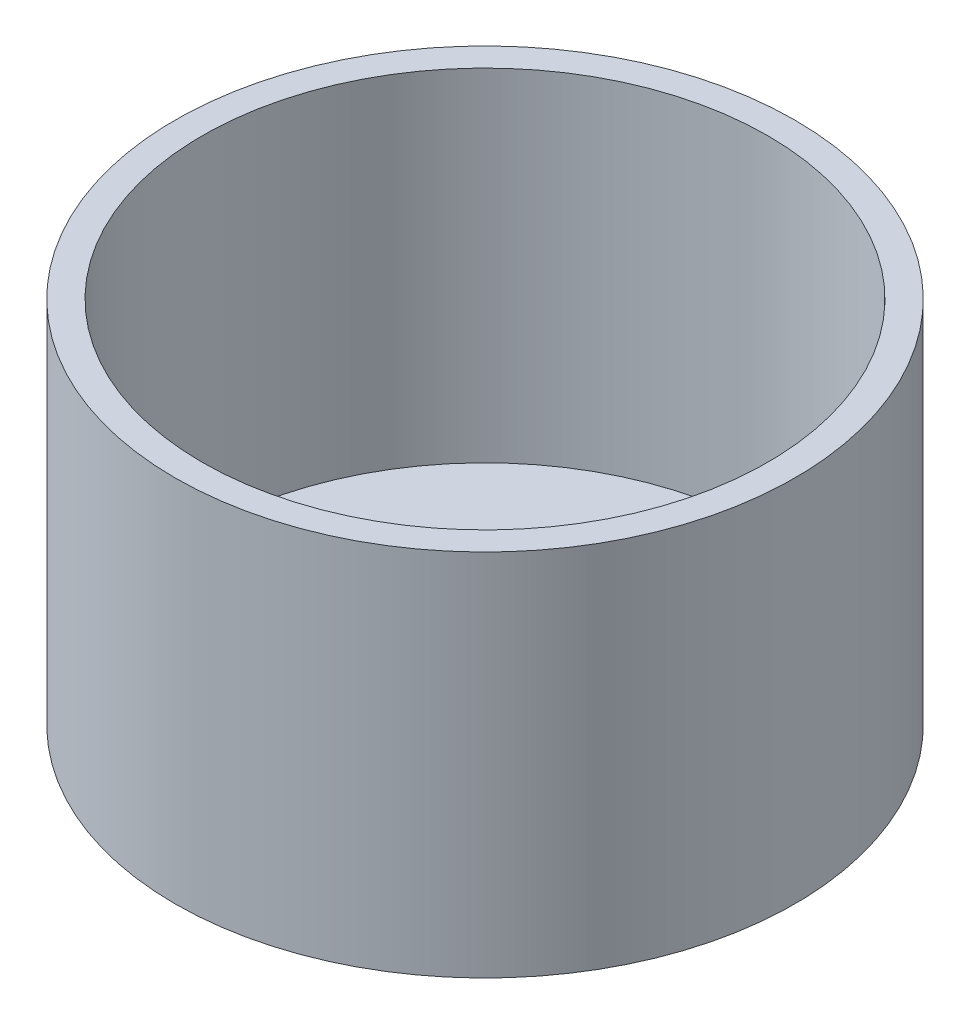
ISO-10303-21;
HEADER;
FILE_DESCRIPTION(('STEP AP214'),'2;1');
FILE_NAME('part.step','',(''),(''),'','','');
FILE_SCHEMA(('AUTOMOTIVE_DESIGN { 1 0 10303 214 1 1 1 1 }'));
ENDSEC;
DATA;
#1=APPLICATION_CONTEXT('core data for automotive mechanical design processes');
#2=APPLICATION_PROTOCOL_DEFINITION('international standard','automotive_design',2000,#1);
#3=PRODUCT_CONTEXT('',#1,'mechanical');
#4=PRODUCT('Part','Part','',(#3));
#5=PRODUCT_RELATED_PRODUCT_CATEGORY('part','',(#4));
#6=PRODUCT_DEFINITION_FORMATION('','',#4);
#7=PRODUCT_DEFINITION_CONTEXT('part definition',#1,'design');
#8=PRODUCT_DEFINITION('design','',#6,#7);
#9=PRODUCT_DEFINITION_SHAPE('','',#8);
#10=(LENGTH_UNIT() NAMED_UNIT(*) SI_UNIT(.MILLI.,.METRE.));
#11=(NAMED_UNIT(*) PLANE_ANGLE_UNIT() SI_UNIT($,.RADIAN.));
#12=(NAMED_UNIT(*) SI_UNIT($,.STERADIAN.) SOLID_ANGLE_UNIT());
#13=UNCERTAINTY_MEASURE_WITH_UNIT(LENGTH_MEASURE(1.E-05),#10,'distance_accuracy_value','');
#14=(GEOMETRIC_REPRESENTATION_CONTEXT(3) GLOBAL_UNCERTAINTY_ASSIGNED_CONTEXT((#13)) GLOBAL_UNIT_ASSIGNED_CONTEXT((#10,
#11,#12)) REPRESENTATION_CONTEXT('',''));
#15=CARTESIAN_POINT('',(0.,0.,0.));
#16=DIRECTION('',(0.,0.,1.));
#17=DIRECTION('',(1.,0.,0.));
#18=AXIS2_PLACEMENT_3D('',#15,#16,#17);
#19=CARTESIAN_POINT('',(0.,0.,0.));
#20=DIRECTION('',(0.,1.,0.));
#21=DIRECTION('',(0.,0.,1.));
#22=AXIS2_PLACEMENT_3D('',#19,#20,#21);
#23=PLANE('',#22);
#24=CARTESIAN_POINT('',(0.,0.,-8.5));
#25=DIRECTION('',(0.,-1.,0.));
#26=DIRECTION('',(-1.,0.,0.));
#27=AXIS2_PLACEMENT_3D('',#24,#25,#26);
#28=CIRCLE('',#27,1.55);
#29=CARTESIAN_POINT('',(-1.55000000000003,0.,-8.49999999999999));
#30=VERTEX_POINT('',#29);
#31=EDGE_CURVE('E72',#30,#30,#28,.T.);
#32=ORIENTED_EDGE('',*,*,#31,.F.);
#33=EDGE_LOOP('',(#32));
#34=FACE_BOUND('',#33,.T.);
#35=CARTESIAN_POINT('',(-8.5,0.,0.));
#36=DIRECTION('',(0.,-1.,0.));
#37=DIRECTION('',(0.,0.,1.));
#38=AXIS2_PLACEMENT_3D('',#35,#36,#37);
#39=CIRCLE('',#38,1.55);
#40=CARTESIAN_POINT('',(-8.5,0.,1.55));
#41=VERTEX_POINT('',#40);
#42=EDGE_CURVE('E62',#41,#41,#39,.T.);
#43=ORIENTED_EDGE('',*,*,#42,.F.);
#44=EDGE_LOOP('',(#43));
#45=FACE_BOUND('',#44,.T.);
#46=CARTESIAN_POINT('',(0.,0.,8.5));
#47=DIRECTION('',(0.,-1.,0.));
#48=DIRECTION('',(1.,0.,0.));
#49=AXIS2_PLACEMENT_3D('',#46,#47,#48);
#50=CIRCLE('',#49,1.55);
#51=CARTESIAN_POINT('',(1.55000000000009,0.,8.49999999999999));
#52=VERTEX_POINT('',#51);
#53=EDGE_CURVE('E59',#52,#52,#50,.T.);
#54=ORIENTED_EDGE('',*,*,#53,.F.);
#55=EDGE_LOOP('',(#54));
#56=FACE_BOUND('',#55,.T.);
#57=CARTESIAN_POINT('',(8.5,0.,0.));
#58=DIRECTION('',(0.,-1.,0.));
#59=DIRECTION('',(0.,0.,-1.));
#60=AXIS2_PLACEMENT_3D('',#57,#58,#59);
#61=CIRCLE('',#60,1.55);
#62=CARTESIAN_POINT('',(8.5,0.,-1.55));
#63=VERTEX_POINT('',#62);
#64=EDGE_CURVE('E56',#63,#63,#61,.T.);
#65=ORIENTED_EDGE('',*,*,#64,.F.);
#66=EDGE_LOOP('',(#65));
#67=FACE_BOUND('',#66,.T.);
#68=CARTESIAN_POINT('',(0.,0.,0.));
#69=DIRECTION('',(0.,-1.,0.));
#70=DIRECTION('',(0.,0.,-1.));
#71=AXIS2_PLACEMENT_3D('',#68,#69,#70);
#72=CIRCLE('',#71,2.2);
#73=CARTESIAN_POINT('',(0.,0.,-2.2));
#74=VERTEX_POINT('',#73);
#75=EDGE_CURVE('E52',#74,#74,#72,.T.);
#76=ORIENTED_EDGE('',*,*,#75,.F.);
#77=EDGE_LOOP('',(#76));
#78=FACE_BOUND('',#77,.T.);
#79=CARTESIAN_POINT('',(0.,0.,0.));
#80=DIRECTION('',(0.,1.,0.));
#81=DIRECTION('',(0.,0.,1.));
#82=AXIS2_PLACEMENT_3D('',#79,#80,#81);
#83=CIRCLE('',#82,25.2);
#84=CARTESIAN_POINT('',(0.,0.,25.2));
#85=VERTEX_POINT('',#84);
#86=EDGE_CURVE('E10',#85,#85,#83,.T.);
#87=ORIENTED_EDGE('',*,*,#86,.F.);
#88=EDGE_LOOP('',(#87));
#89=FACE_BOUND('',#88,.T.);
#90=ADVANCED_FACE('F32',(#34,#45,#56,#67,#78,#89),#23,.F.);
#91=CARTESIAN_POINT('',(0.,2.2,0.));
#92=DIRECTION('',(0.,1.,0.));
#93=DIRECTION('',(0.,0.,1.));
#94=AXIS2_PLACEMENT_3D('',#91,#92,#93);
#95=CYLINDRICAL_SURFACE('',#94,25.2);
#96=CARTESIAN_POINT('',(0.,30.,0.));
#97=DIRECTION('',(0.,1.,0.));
#98=DIRECTION('',(0.,0.,1.));
#99=AXIS2_PLACEMENT_3D('',#96,#97,#98);
#100=CIRCLE('',#99,25.2);
#101=CARTESIAN_POINT('',(0.,30.,25.2));
#102=VERTEX_POINT('',#101);
#103=EDGE_CURVE('E39',#102,#102,#100,.T.);
#104=ORIENTED_EDGE('',*,*,#103,.F.);
#105=EDGE_LOOP('',(#104));
#106=FACE_BOUND('',#105,.T.);
#107=ORIENTED_EDGE('',*,*,#86,.T.);
#108=EDGE_LOOP('',(#107));
#109=FACE_BOUND('',#108,.T.);
#110=ADVANCED_FACE('F88',(#106,#109),#95,.T.);
#111=CARTESIAN_POINT('',(23.,30.,0.));
#112=DIRECTION('',(0.,-1.,0.));
#113=DIRECTION('',(0.,0.,-1.));
#114=AXIS2_PLACEMENT_3D('',#111,#112,#113);
#115=PLANE('',#114);
#116=CARTESIAN_POINT('',(0.,30.,0.));
#117=DIRECTION('',(0.,1.,0.));
#118=DIRECTION('',(0.,0.,1.));
#119=AXIS2_PLACEMENT_3D('',#116,#117,#118);
#120=CIRCLE('',#119,23.);
#121=CARTESIAN_POINT('',(0.,30.,23.));
#122=VERTEX_POINT('',#121);
#123=EDGE_CURVE('E44',#122,#122,#120,.T.);
#124=ORIENTED_EDGE('',*,*,#123,.F.);
#125=EDGE_LOOP('',(#124));
#126=FACE_BOUND('',#125,.T.);
#127=ORIENTED_EDGE('',*,*,#103,.T.);
#128=EDGE_LOOP('',(#127));
#129=FACE_BOUND('',#128,.T.);
#130=ADVANCED_FACE('F85',(#126,#129),#115,.F.);
#131=CARTESIAN_POINT('',(0.,2.2,0.));
#132=DIRECTION('',(0.,1.,0.));
#133=DIRECTION('',(0.,0.,1.));
#134=AXIS2_PLACEMENT_3D('',#131,#132,#133);
#135=CYLINDRICAL_SURFACE('',#134,23.);
#136=CARTESIAN_POINT('',(0.,2.2,0.));
#137=DIRECTION('',(0.,1.,0.));
#138=DIRECTION('',(0.,0.,1.));
#139=AXIS2_PLACEMENT_3D('',#136,#137,#138);
#140=CIRCLE('',#139,23.);
#141=CARTESIAN_POINT('',(0.,2.2,23.));
#142=VERTEX_POINT('',#141);
#143=EDGE_CURVE('E51',#142,#142,#140,.T.);
#144=ORIENTED_EDGE('',*,*,#143,.F.);
#145=EDGE_LOOP('',(#144));
#146=FACE_BOUND('',#145,.T.);
#147=ORIENTED_EDGE('',*,*,#123,.T.);
#148=EDGE_LOOP('',(#147));
#149=FACE_BOUND('',#148,.T.);
#150=ADVANCED_FACE('F83',(#146,#149),#135,.F.);
#151=CARTESIAN_POINT('',(0.,2.2,0.));
#152=DIRECTION('',(0.,-1.,0.));
#153=DIRECTION('',(0.,0.,-1.));
#154=AXIS2_PLACEMENT_3D('',#151,#152,#153);
#155=PLANE('',#154);
#156=CARTESIAN_POINT('',(0.,2.2,-8.5));
#157=DIRECTION('',(0.,-1.,0.));
#158=DIRECTION('',(0.,0.,-1.));
#159=AXIS2_PLACEMENT_3D('',#156,#157,#158);
#160=CIRCLE('',#159,1.55);
#161=CARTESIAN_POINT('',(0.,2.2,-10.05));
#162=VERTEX_POINT('',#161);
#163=EDGE_CURVE('E35',#162,#162,#160,.T.);
#164=ORIENTED_EDGE('',*,*,#163,.T.);
#165=EDGE_LOOP('',(#164));
#166=FACE_BOUND('',#165,.T.);
#167=CARTESIAN_POINT('',(-8.5,2.2,0.));
#168=DIRECTION('',(0.,-1.,0.));
#169=DIRECTION('',(0.,0.,-1.));
#170=AXIS2_PLACEMENT_3D('',#167,#168,#169);
#171=CIRCLE('',#170,1.55);
#172=CARTESIAN_POINT('',(-8.5,2.2,-1.55));
#173=VERTEX_POINT('',#172);
#174=EDGE_CURVE('E60',#173,#173,#171,.T.);
#175=ORIENTED_EDGE('',*,*,#174,.T.);
#176=EDGE_LOOP('',(#175));
#177=FACE_BOUND('',#176,.T.);
#178=CARTESIAN_POINT('',(0.,2.2,8.5));
#179=DIRECTION('',(0.,-1.,0.));
#180=DIRECTION('',(0.,0.,-1.));
#181=AXIS2_PLACEMENT_3D('',#178,#179,#180);
#182=CIRCLE('',#181,1.55);
#183=CARTESIAN_POINT('',(0.,2.2,6.95));
#184=VERTEX_POINT('',#183);
#185=EDGE_CURVE('E57',#184,#184,#182,.T.);
#186=ORIENTED_EDGE('',*,*,#185,.T.);
#187=EDGE_LOOP('',(#186));
#188=FACE_BOUND('',#187,.T.);
#189=CARTESIAN_POINT('',(8.5,2.2,0.));
#190=DIRECTION('',(0.,-1.,0.));
#191=DIRECTION('',(0.,0.,-1.));
#192=AXIS2_PLACEMENT_3D('',#189,#190,#191);
#193=CIRCLE('',#192,1.55);
#194=CARTESIAN_POINT('',(8.5,2.2,-1.55));
#195=VERTEX_POINT('',#194);
#196=EDGE_CURVE('E53',#195,#195,#193,.T.);
#197=ORIENTED_EDGE('',*,*,#196,.T.);
#198=EDGE_LOOP('',(#197));
#199=FACE_BOUND('',#198,.T.);
#200=CARTESIAN_POINT('',(0.,2.2,0.));
#201=DIRECTION('',(0.,-1.,0.));
#202=DIRECTION('',(0.,0.,-1.));
#203=AXIS2_PLACEMENT_3D('',#200,#201,#202);
#204=CIRCLE('',#203,2.2);
#205=CARTESIAN_POINT('',(0.,2.2,-2.2));
#206=VERTEX_POINT('',#205);
#207=EDGE_CURVE('E48',#206,#206,#204,.T.);
#208=ORIENTED_EDGE('',*,*,#207,.T.);
#209=EDGE_LOOP('',(#208));
#210=FACE_BOUND('',#209,.T.);
#211=ORIENTED_EDGE('',*,*,#143,.T.);
#212=EDGE_LOOP('',(#211));
#213=FACE_BOUND('',#212,.T.);
#214=ADVANCED_FACE('F100',(#166,#177,#188,#199,#210,#213),#155,.F.);
#215=CARTESIAN_POINT('',(0.,30.,0.));
#216=DIRECTION('',(0.,-1.,0.));
#217=DIRECTION('',(0.,0.,-1.));
#218=AXIS2_PLACEMENT_3D('',#215,#216,#217);
#219=CYLINDRICAL_SURFACE('',#218,2.2);
#220=ORIENTED_EDGE('',*,*,#75,.T.);
#221=EDGE_LOOP('',(#220));
#222=FACE_BOUND('',#221,.T.);
#223=ORIENTED_EDGE('',*,*,#207,.F.);
#224=EDGE_LOOP('',(#223));
#225=FACE_BOUND('',#224,.T.);
#226=ADVANCED_FACE('F104',(#222,#225),#219,.F.);
#227=CARTESIAN_POINT('',(8.5,30.,0.));
#228=DIRECTION('',(0.,-1.,0.));
#229=DIRECTION('',(0.,0.,-1.));
#230=AXIS2_PLACEMENT_3D('',#227,#228,#229);
#231=CYLINDRICAL_SURFACE('',#230,1.55);
#232=ORIENTED_EDGE('',*,*,#64,.T.);
#233=EDGE_LOOP('',(#232));
#234=FACE_BOUND('',#233,.T.);
#235=ORIENTED_EDGE('',*,*,#196,.F.);
#236=EDGE_LOOP('',(#235));
#237=FACE_BOUND('',#236,.T.);
#238=ADVANCED_FACE('F108',(#234,#237),#231,.F.);
#239=CARTESIAN_POINT('',(0.,30.,8.5));
#240=DIRECTION('',(0.,-1.,0.));
#241=DIRECTION('',(0.,0.,-1.));
#242=AXIS2_PLACEMENT_3D('',#239,#240,#241);
#243=CYLINDRICAL_SURFACE('',#242,1.55);
#244=ORIENTED_EDGE('',*,*,#53,.T.);
#245=EDGE_LOOP('',(#244));
#246=FACE_BOUND('',#245,.T.);
#247=ORIENTED_EDGE('',*,*,#185,.F.);
#248=EDGE_LOOP('',(#247));
#249=FACE_BOUND('',#248,.T.);
#250=ADVANCED_FACE('F112',(#246,#249),#243,.F.);
#251=CARTESIAN_POINT('',(-8.5,30.,0.));
#252=DIRECTION('',(0.,-1.,0.));
#253=DIRECTION('',(0.,0.,-1.));
#254=AXIS2_PLACEMENT_3D('',#251,#252,#253);
#255=CYLINDRICAL_SURFACE('',#254,1.55);
#256=ORIENTED_EDGE('',*,*,#42,.T.);
#257=EDGE_LOOP('',(#256));
#258=FACE_BOUND('',#257,.T.);
#259=ORIENTED_EDGE('',*,*,#174,.F.);
#260=EDGE_LOOP('',(#259));
#261=FACE_BOUND('',#260,.T.);
#262=ADVANCED_FACE('F116',(#258,#261),#255,.F.);
#263=CARTESIAN_POINT('',(0.,30.,-8.5));
#264=DIRECTION('',(0.,-1.,0.));
#265=DIRECTION('',(0.,0.,-1.));
#266=AXIS2_PLACEMENT_3D('',#263,#264,#265);
#267=CYLINDRICAL_SURFACE('',#266,1.55);
#268=ORIENTED_EDGE('',*,*,#31,.T.);
#269=EDGE_LOOP('',(#268));
#270=FACE_BOUND('',#269,.T.);
#271=ORIENTED_EDGE('',*,*,#163,.F.);
#272=EDGE_LOOP('',(#271));
#273=FACE_BOUND('',#272,.T.);
#274=ADVANCED_FACE('F120',(#270,#273),#267,.F.);
#275=CLOSED_SHELL('',(#90,#110,#130,#150,#214,#226,#238,#250,#262,#274));
#276=MANIFOLD_SOLID_BREP('B2',#275);
#277=ADVANCED_BREP_SHAPE_REPRESENTATION('',(#18,#276),#14);
#278=SHAPE_DEFINITION_REPRESENTATION(#9,#277);
ENDSEC;
END-ISO-10303-21;
